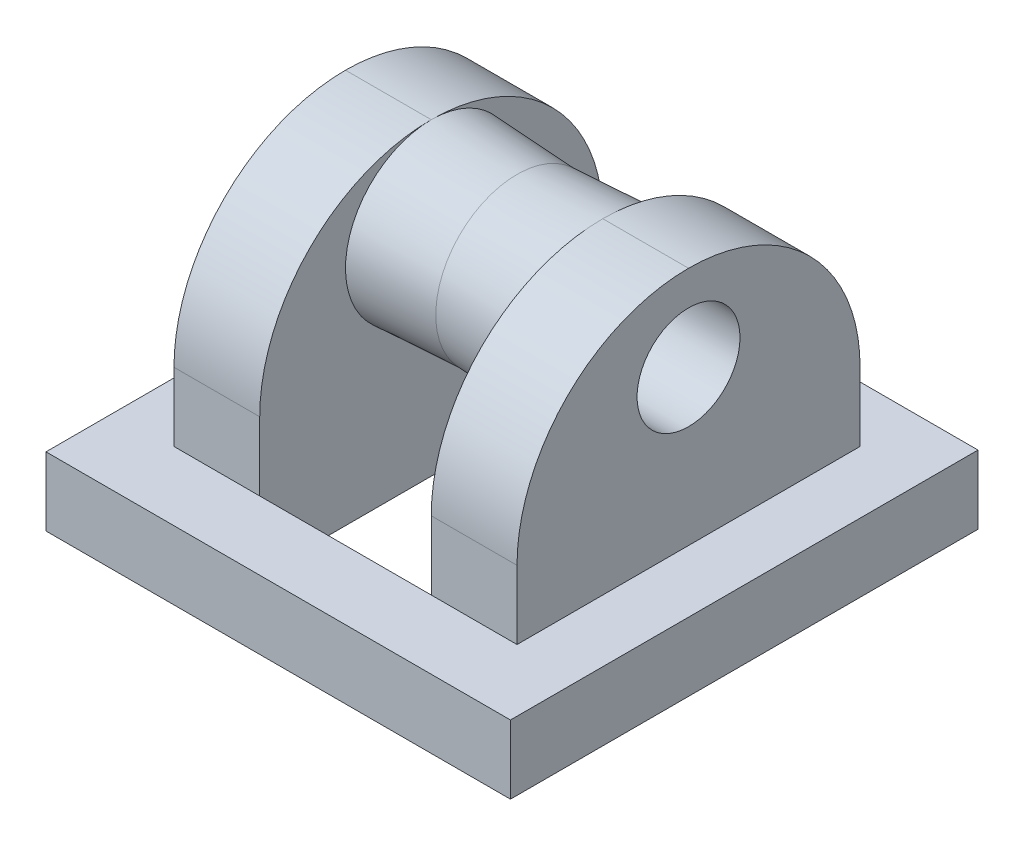
ISO-10303-21;
HEADER;
FILE_DESCRIPTION(('STEP AP214'),'2;1');
FILE_NAME('part.step','',(''),(''),'','','');
FILE_SCHEMA(('AUTOMOTIVE_DESIGN { 1 0 10303 214 1 1 1 1 }'));
ENDSEC;
DATA;
#1=APPLICATION_CONTEXT('core data for automotive mechanical design processes');
#2=APPLICATION_PROTOCOL_DEFINITION('international standard','automotive_design',2000,#1);
#3=PRODUCT_CONTEXT('',#1,'mechanical');
#4=PRODUCT('Part','Part','',(#3));
#5=PRODUCT_RELATED_PRODUCT_CATEGORY('part','',(#4));
#6=PRODUCT_DEFINITION_FORMATION('','',#4);
#7=PRODUCT_DEFINITION_CONTEXT('part definition',#1,'design');
#8=PRODUCT_DEFINITION('design','',#6,#7);
#9=PRODUCT_DEFINITION_SHAPE('','',#8);
#10=(LENGTH_UNIT() NAMED_UNIT(*) SI_UNIT(.MILLI.,.METRE.));
#11=(NAMED_UNIT(*) PLANE_ANGLE_UNIT() SI_UNIT($,.RADIAN.));
#12=(NAMED_UNIT(*) SI_UNIT($,.STERADIAN.) SOLID_ANGLE_UNIT());
#13=UNCERTAINTY_MEASURE_WITH_UNIT(LENGTH_MEASURE(1.E-05),#10,'distance_accuracy_value','');
#14=(GEOMETRIC_REPRESENTATION_CONTEXT(3) GLOBAL_UNCERTAINTY_ASSIGNED_CONTEXT((#13)) GLOBAL_UNIT_ASSIGNED_CONTEXT((#10,
#11,#12)) REPRESENTATION_CONTEXT('',''));
#15=CARTESIAN_POINT('',(0.,0.,0.));
#16=DIRECTION('',(0.,0.,1.));
#17=DIRECTION('',(1.,0.,0.));
#18=AXIS2_PLACEMENT_3D('',#15,#16,#17);
#19=CARTESIAN_POINT('',(0.,115.,20.));
#20=DIRECTION('',(0.,-1.,0.));
#21=DIRECTION('',(0.,0.,-1.));
#22=AXIS2_PLACEMENT_3D('',#19,#20,#21);
#23=PLANE('',#22);
#24=DIRECTION('',(-1.,0.,0.));
#25=VECTOR('',#24,1.);
#26=CARTESIAN_POINT('',(0.,115.,20.));
#27=LINE('',#26,#25);
#28=CARTESIAN_POINT('',(75.8087652062624,115.,20.));
#29=VERTEX_POINT('',#28);
#30=CARTESIAN_POINT('',(62.2696434049317,115.,20.));
#31=VERTEX_POINT('',#30);
#32=EDGE_CURVE('E61',#29,#31,#27,.T.);
#33=ORIENTED_EDGE('',*,*,#32,.F.);
#34=DIRECTION('',(0.,0.,1.));
#35=VECTOR('',#34,1.);
#36=CARTESIAN_POINT('',(75.8087652062624,115.,20.));
#37=LINE('',#36,#35);
#38=CARTESIAN_POINT('',(75.8087652062624,115.,6.37093213171585));
#39=VERTEX_POINT('',#38);
#40=EDGE_CURVE('E170',#39,#29,#37,.T.);
#41=ORIENTED_EDGE('',*,*,#40,.F.);
#42=DIRECTION('',(1.,0.,0.));
#43=VECTOR('',#42,1.);
#44=CARTESIAN_POINT('',(75.8087652062624,115.,6.37093213171585));
#45=LINE('',#44,#43);
#46=CARTESIAN_POINT('',(62.2696434049317,115.,6.37093213171585));
#47=VERTEX_POINT('',#46);
#48=EDGE_CURVE('E155',#47,#39,#45,.T.);
#49=ORIENTED_EDGE('',*,*,#48,.F.);
#50=DIRECTION('',(0.,0.,1.));
#51=VECTOR('',#50,1.);
#52=CARTESIAN_POINT('',(62.2696434049317,115.,20.));
#53=LINE('',#52,#51);
#54=EDGE_CURVE('E175',#47,#31,#53,.T.);
#55=ORIENTED_EDGE('',*,*,#54,.T.);
#56=EDGE_LOOP('',(#33,#41,#49,#55));
#57=FACE_BOUND('',#56,.T.);
#58=DIRECTION('',(-1.,0.,0.));
#59=VECTOR('',#58,1.);
#60=CARTESIAN_POINT('',(0.,115.,18.));
#61=LINE('',#60,#59);
#62=CARTESIAN_POINT('',(73.9999999999999,115.,18.));
#63=VERTEX_POINT('',#62);
#64=CARTESIAN_POINT('',(71.4999999999999,115.,18.));
#65=VERTEX_POINT('',#64);
#66=EDGE_CURVE('E242',#63,#65,#61,.T.);
#67=ORIENTED_EDGE('',*,*,#66,.T.);
#68=DIRECTION('',(1.,0.,0.));
#69=VECTOR('',#68,1.);
#70=CARTESIAN_POINT('',(66.4999999999999,115.,18.));
#71=LINE('',#70,#69);
#72=CARTESIAN_POINT('',(66.4999999999999,115.,18.));
#73=VERTEX_POINT('',#72);
#74=EDGE_CURVE('E282',#73,#65,#71,.T.);
#75=ORIENTED_EDGE('',*,*,#74,.F.);
#76=DIRECTION('',(-1.,0.,0.));
#77=VECTOR('',#76,1.);
#78=CARTESIAN_POINT('',(0.,115.,18.));
#79=LINE('',#78,#77);
#80=CARTESIAN_POINT('',(63.9999999999999,115.,18.));
#81=VERTEX_POINT('',#80);
#82=EDGE_CURVE('E239',#73,#81,#79,.T.);
#83=ORIENTED_EDGE('',*,*,#82,.T.);
#84=DIRECTION('',(0.,0.,1.));
#85=VECTOR('',#84,1.);
#86=CARTESIAN_POINT('',(63.9999999999999,115.,0.));
#87=LINE('',#86,#85);
#88=CARTESIAN_POINT('',(63.9999999999999,115.,7.99999999999999));
#89=VERTEX_POINT('',#88);
#90=EDGE_CURVE('E189',#89,#81,#87,.T.);
#91=ORIENTED_EDGE('',*,*,#90,.F.);
#92=DIRECTION('',(-1.,0.,0.));
#93=VECTOR('',#92,1.);
#94=CARTESIAN_POINT('',(0.,115.,8.00000000000001));
#95=LINE('',#94,#93);
#96=CARTESIAN_POINT('',(66.4999999999999,115.,7.99999999999999));
#97=VERTEX_POINT('',#96);
#98=EDGE_CURVE('E207',#97,#89,#95,.T.);
#99=ORIENTED_EDGE('',*,*,#98,.F.);
#100=DIRECTION('',(-1.,0.,0.));
#101=VECTOR('',#100,1.);
#102=CARTESIAN_POINT('',(66.4999999999999,115.,7.99999999999999));
#103=LINE('',#102,#101);
#104=CARTESIAN_POINT('',(71.4999999999999,115.,7.99999999999999));
#105=VERTEX_POINT('',#104);
#106=EDGE_CURVE('E46',#105,#97,#103,.T.);
#107=ORIENTED_EDGE('',*,*,#106,.F.);
#108=DIRECTION('',(-1.,0.,0.));
#109=VECTOR('',#108,1.);
#110=CARTESIAN_POINT('',(0.,115.,8.00000000000001));
#111=LINE('',#110,#109);
#112=CARTESIAN_POINT('',(73.9999999999999,115.,7.99999999999999));
#113=VERTEX_POINT('',#112);
#114=EDGE_CURVE('E227',#113,#105,#111,.T.);
#115=ORIENTED_EDGE('',*,*,#114,.F.);
#116=DIRECTION('',(0.,0.,1.));
#117=VECTOR('',#116,1.);
#118=CARTESIAN_POINT('',(73.9999999999999,115.,0.));
#119=LINE('',#118,#117);
#120=EDGE_CURVE('E229',#113,#63,#119,.T.);
#121=ORIENTED_EDGE('',*,*,#120,.T.);
#122=EDGE_LOOP('',(#67,#75,#83,#91,#99,#107,#115,#121));
#123=FACE_BOUND('',#122,.T.);
#124=ADVANCED_FACE('F37',(#57,#123),#23,.F.);
#125=CARTESIAN_POINT('',(0.,0.,20.));
#126=DIRECTION('',(0.,0.,1.));
#127=DIRECTION('',(1.,0.,0.));
#128=AXIS2_PLACEMENT_3D('',#125,#126,#127);
#129=PLANE('',#128);
#130=DIRECTION('',(0.,1.,0.));
#131=VECTOR('',#130,1.);
#132=CARTESIAN_POINT('',(75.8087652062624,113.,20.));
#133=LINE('',#132,#131);
#134=CARTESIAN_POINT('',(75.8087652062624,113.,20.));
#135=VERTEX_POINT('',#134);
#136=EDGE_CURVE('E158',#135,#29,#133,.T.);
#137=ORIENTED_EDGE('',*,*,#136,.T.);
#138=ORIENTED_EDGE('',*,*,#32,.T.);
#139=DIRECTION('',(0.,-1.,0.));
#140=VECTOR('',#139,1.);
#141=CARTESIAN_POINT('',(62.2696434049317,135.320705917891,20.));
#142=LINE('',#141,#140);
#143=CARTESIAN_POINT('',(62.2696434049317,113.,20.));
#144=VERTEX_POINT('',#143);
#145=EDGE_CURVE('E41',#31,#144,#142,.T.);
#146=ORIENTED_EDGE('',*,*,#145,.T.);
#147=DIRECTION('',(-1.,0.,0.));
#148=VECTOR('',#147,1.);
#149=CARTESIAN_POINT('',(0.,113.,20.));
#150=LINE('',#149,#148);
#151=EDGE_CURVE('E230',#135,#144,#150,.T.);
#152=ORIENTED_EDGE('',*,*,#151,.F.);
#153=EDGE_LOOP('',(#137,#138,#146,#152));
#154=FACE_BOUND('',#153,.T.);
#155=ADVANCED_FACE('F306',(#154),#129,.T.);
#156=CARTESIAN_POINT('',(0.,113.,20.));
#157=DIRECTION('',(0.,-1.,0.));
#158=DIRECTION('',(0.,0.,-1.));
#159=AXIS2_PLACEMENT_3D('',#156,#157,#158);
#160=PLANE('',#159);
#161=DIRECTION('',(0.,0.,1.));
#162=VECTOR('',#161,1.);
#163=CARTESIAN_POINT('',(75.8087652062624,113.,20.));
#164=LINE('',#163,#162);
#165=CARTESIAN_POINT('',(75.8087652062624,113.,6.37093213171585));
#166=VERTEX_POINT('',#165);
#167=EDGE_CURVE('E162',#166,#135,#164,.T.);
#168=ORIENTED_EDGE('',*,*,#167,.T.);
#169=ORIENTED_EDGE('',*,*,#151,.T.);
#170=DIRECTION('',(0.,0.,1.));
#171=VECTOR('',#170,1.);
#172=CARTESIAN_POINT('',(62.2696434049317,113.,20.));
#173=LINE('',#172,#171);
#174=CARTESIAN_POINT('',(62.2696434049317,113.,6.37093213171585));
#175=VERTEX_POINT('',#174);
#176=EDGE_CURVE('E11',#175,#144,#173,.T.);
#177=ORIENTED_EDGE('',*,*,#176,.F.);
#178=DIRECTION('',(1.,0.,0.));
#179=VECTOR('',#178,1.);
#180=CARTESIAN_POINT('',(75.8087652062624,113.,6.37093213171585));
#181=LINE('',#180,#179);
#182=EDGE_CURVE('E53',#175,#166,#181,.T.);
#183=ORIENTED_EDGE('',*,*,#182,.T.);
#184=EDGE_LOOP('',(#168,#169,#177,#183));
#185=FACE_BOUND('',#184,.T.);
#186=DIRECTION('',(1.,0.,0.));
#187=VECTOR('',#186,1.);
#188=CARTESIAN_POINT('',(66.4999999999999,113.,18.));
#189=LINE('',#188,#187);
#190=CARTESIAN_POINT('',(66.4999999999999,113.,18.));
#191=VERTEX_POINT('',#190);
#192=CARTESIAN_POINT('',(71.4999999999999,113.,18.));
#193=VERTEX_POINT('',#192);
#194=EDGE_CURVE('E232',#191,#193,#189,.T.);
#195=ORIENTED_EDGE('',*,*,#194,.T.);
#196=DIRECTION('',(0.,0.,-1.));
#197=VECTOR('',#196,1.);
#198=CARTESIAN_POINT('',(71.4999999999999,113.,18.));
#199=LINE('',#198,#197);
#200=CARTESIAN_POINT('',(71.4999999999999,113.,7.99999999999999));
#201=VERTEX_POINT('',#200);
#202=EDGE_CURVE('E288',#193,#201,#199,.T.);
#203=ORIENTED_EDGE('',*,*,#202,.T.);
#204=DIRECTION('',(-1.,0.,0.));
#205=VECTOR('',#204,1.);
#206=CARTESIAN_POINT('',(66.4999999999999,113.,7.99999999999999));
#207=LINE('',#206,#205);
#208=CARTESIAN_POINT('',(66.4999999999999,113.,7.99999999999999));
#209=VERTEX_POINT('',#208);
#210=EDGE_CURVE('E291',#201,#209,#207,.T.);
#211=ORIENTED_EDGE('',*,*,#210,.T.);
#212=DIRECTION('',(0.,0.,1.));
#213=VECTOR('',#212,1.);
#214=CARTESIAN_POINT('',(66.4999999999999,113.,18.));
#215=LINE('',#214,#213);
#216=EDGE_CURVE('E194',#209,#191,#215,.T.);
#217=ORIENTED_EDGE('',*,*,#216,.T.);
#218=EDGE_LOOP('',(#195,#203,#211,#217));
#219=FACE_BOUND('',#218,.T.);
#220=ADVANCED_FACE('F168',(#185,#219),#160,.T.);
#221=CARTESIAN_POINT('',(66.4999999999999,122.,0.));
#222=DIRECTION('',(1.,0.,0.));
#223=DIRECTION('',(0.,0.,-1.));
#224=AXIS2_PLACEMENT_3D('',#221,#222,#223);
#225=PLANE('',#224);
#226=CARTESIAN_POINT('',(66.4999999999999,117.,13.));
#227=DIRECTION('',(1.,0.,0.));
#228=DIRECTION('',(0.,0.,-1.));
#229=AXIS2_PLACEMENT_3D('',#226,#227,#228);
#230=CIRCLE('',#229,5.);
#231=CARTESIAN_POINT('',(66.4999999999999,117.,7.99999999999999));
#232=VERTEX_POINT('',#231);
#233=CARTESIAN_POINT('',(66.4999999999999,122.,13.));
#234=VERTEX_POINT('',#233);
#235=EDGE_CURVE('E190',#232,#234,#230,.T.);
#236=ORIENTED_EDGE('',*,*,#235,.T.);
#237=CARTESIAN_POINT('',(66.4999999999999,119.5,13.));
#238=DIRECTION('',(1.,0.,0.));
#239=DIRECTION('',(0.,0.,-1.));
#240=AXIS2_PLACEMENT_3D('',#237,#238,#239);
#241=CIRCLE('',#240,2.5);
#242=EDGE_CURVE('E275',#234,#234,#241,.T.);
#243=ORIENTED_EDGE('',*,*,#242,.F.);
#244=CARTESIAN_POINT('',(66.4999999999999,117.,13.));
#245=DIRECTION('',(1.,0.,0.));
#246=DIRECTION('',(0.,0.,-1.));
#247=AXIS2_PLACEMENT_3D('',#244,#245,#246);
#248=CIRCLE('',#247,5.);
#249=CARTESIAN_POINT('',(66.4999999999999,117.,18.));
#250=VERTEX_POINT('',#249);
#251=EDGE_CURVE('E193',#234,#250,#248,.T.);
#252=ORIENTED_EDGE('',*,*,#251,.T.);
#253=DIRECTION('',(0.,-1.,0.));
#254=VECTOR('',#253,1.);
#255=CARTESIAN_POINT('',(66.4999999999999,122.,18.));
#256=LINE('',#255,#254);
#257=EDGE_CURVE('E196',#250,#73,#256,.T.);
#258=ORIENTED_EDGE('',*,*,#257,.T.);
#259=DIRECTION('',(0.,1.,0.));
#260=VECTOR('',#259,1.);
#261=CARTESIAN_POINT('',(66.4999999999999,101.819660112501,18.));
#262=LINE('',#261,#260);
#263=EDGE_CURVE('E272',#191,#73,#262,.T.);
#264=ORIENTED_EDGE('',*,*,#263,.F.);
#265=ORIENTED_EDGE('',*,*,#216,.F.);
#266=DIRECTION('',(0.,1.,0.));
#267=VECTOR('',#266,1.);
#268=CARTESIAN_POINT('',(66.4999999999999,101.819660112501,7.99999999999999));
#269=LINE('',#268,#267);
#270=EDGE_CURVE('E201',#209,#97,#269,.T.);
#271=ORIENTED_EDGE('',*,*,#270,.T.);
#272=DIRECTION('',(0.,-1.,0.));
#273=VECTOR('',#272,1.);
#274=CARTESIAN_POINT('',(66.4999999999999,122.,7.99999999999999));
#275=LINE('',#274,#273);
#276=EDGE_CURVE('E200',#232,#97,#275,.T.);
#277=ORIENTED_EDGE('',*,*,#276,.F.);
#278=EDGE_LOOP('',(#236,#243,#252,#258,#264,#265,#271,#277));
#279=FACE_BOUND('',#278,.T.);
#280=ADVANCED_FACE('F312',(#279),#225,.T.);
#281=CARTESIAN_POINT('',(0.,122.,8.00000000000001));
#282=DIRECTION('',(0.,0.,1.));
#283=DIRECTION('',(1.,0.,0.));
#284=AXIS2_PLACEMENT_3D('',#281,#282,#283);
#285=PLANE('',#284);
#286=DIRECTION('',(0.,-1.,0.));
#287=VECTOR('',#286,1.);
#288=CARTESIAN_POINT('',(63.9999999999999,122.,7.99999999999999));
#289=LINE('',#288,#287);
#290=CARTESIAN_POINT('',(63.9999999999999,117.,7.99999999999999));
#291=VERTEX_POINT('',#290);
#292=EDGE_CURVE('E204',#291,#89,#289,.T.);
#293=ORIENTED_EDGE('',*,*,#292,.F.);
#294=DIRECTION('',(-1.,0.,0.));
#295=VECTOR('',#294,1.);
#296=CARTESIAN_POINT('',(66.4999999999999,117.,7.99999999999999));
#297=LINE('',#296,#295);
#298=EDGE_CURVE('E197',#291,#232,#297,.F.);
#299=ORIENTED_EDGE('',*,*,#298,.T.);
#300=ORIENTED_EDGE('',*,*,#276,.T.);
#301=ORIENTED_EDGE('',*,*,#98,.T.);
#302=EDGE_LOOP('',(#293,#299,#300,#301));
#303=FACE_BOUND('',#302,.T.);
#304=ADVANCED_FACE('F369',(#303),#285,.F.);
#305=CARTESIAN_POINT('',(63.9999999999999,122.,0.));
#306=DIRECTION('',(1.,0.,0.));
#307=DIRECTION('',(0.,0.,-1.));
#308=AXIS2_PLACEMENT_3D('',#305,#306,#307);
#309=PLANE('',#308);
#310=CARTESIAN_POINT('',(63.9999999999999,119.5,13.));
#311=DIRECTION('',(1.,0.,0.));
#312=DIRECTION('',(0.,0.,-1.));
#313=AXIS2_PLACEMENT_3D('',#310,#311,#312);
#314=CIRCLE('',#313,1.5);
#315=CARTESIAN_POINT('',(63.9999999999999,119.5,11.5));
#316=VERTEX_POINT('',#315);
#317=EDGE_CURVE('E264',#316,#316,#314,.F.);
#318=ORIENTED_EDGE('',*,*,#317,.F.);
#319=EDGE_LOOP('',(#318));
#320=FACE_BOUND('',#319,.T.);
#321=CARTESIAN_POINT('',(63.9999999999999,117.,13.));
#322=DIRECTION('',(1.,0.,0.));
#323=DIRECTION('',(0.,0.,-1.));
#324=AXIS2_PLACEMENT_3D('',#321,#322,#323);
#325=CIRCLE('',#324,5.);
#326=CARTESIAN_POINT('',(63.9999999999999,117.,18.));
#327=VERTEX_POINT('',#326);
#328=CARTESIAN_POINT('',(63.9999999999999,122.,13.));
#329=VERTEX_POINT('',#328);
#330=EDGE_CURVE('E205',#327,#329,#325,.F.);
#331=ORIENTED_EDGE('',*,*,#330,.T.);
#332=CARTESIAN_POINT('',(63.9999999999999,117.,13.));
#333=DIRECTION('',(1.,0.,0.));
#334=DIRECTION('',(0.,0.,-1.));
#335=AXIS2_PLACEMENT_3D('',#332,#333,#334);
#336=CIRCLE('',#335,5.);
#337=EDGE_CURVE('E202',#329,#291,#336,.F.);
#338=ORIENTED_EDGE('',*,*,#337,.T.);
#339=ORIENTED_EDGE('',*,*,#292,.T.);
#340=ORIENTED_EDGE('',*,*,#90,.T.);
#341=DIRECTION('',(0.,-1.,0.));
#342=VECTOR('',#341,1.);
#343=CARTESIAN_POINT('',(63.9999999999999,122.,18.));
#344=LINE('',#343,#342);
#345=EDGE_CURVE('E188',#327,#81,#344,.T.);
#346=ORIENTED_EDGE('',*,*,#345,.F.);
#347=EDGE_LOOP('',(#331,#338,#339,#340,#346));
#348=FACE_BOUND('',#347,.T.);
#349=ADVANCED_FACE('F365',(#320,#348),#309,.F.);
#350=CARTESIAN_POINT('',(0.,122.,18.));
#351=DIRECTION('',(0.,0.,1.));
#352=DIRECTION('',(1.,0.,0.));
#353=AXIS2_PLACEMENT_3D('',#350,#351,#352);
#354=PLANE('',#353);
#355=ORIENTED_EDGE('',*,*,#257,.F.);
#356=DIRECTION('',(-1.,0.,0.));
#357=VECTOR('',#356,1.);
#358=CARTESIAN_POINT('',(0.,117.,18.));
#359=LINE('',#358,#357);
#360=EDGE_CURVE('E186',#250,#327,#359,.T.);
#361=ORIENTED_EDGE('',*,*,#360,.T.);
#362=ORIENTED_EDGE('',*,*,#345,.T.);
#363=ORIENTED_EDGE('',*,*,#82,.F.);
#364=EDGE_LOOP('',(#355,#361,#362,#363));
#365=FACE_BOUND('',#364,.T.);
#366=ADVANCED_FACE('F361',(#365),#354,.T.);
#367=CARTESIAN_POINT('',(0.,122.,8.00000000000001));
#368=DIRECTION('',(0.,0.,1.));
#369=DIRECTION('',(1.,0.,0.));
#370=AXIS2_PLACEMENT_3D('',#367,#368,#369);
#371=PLANE('',#370);
#372=DIRECTION('',(0.,-1.,0.));
#373=VECTOR('',#372,1.);
#374=CARTESIAN_POINT('',(71.4999999999999,122.,7.99999999999999));
#375=LINE('',#374,#373);
#376=CARTESIAN_POINT('',(71.4999999999999,117.,7.99999999999999));
#377=VERTEX_POINT('',#376);
#378=EDGE_CURVE('E222',#377,#105,#375,.T.);
#379=ORIENTED_EDGE('',*,*,#378,.F.);
#380=DIRECTION('',(-1.,0.,0.));
#381=VECTOR('',#380,1.);
#382=CARTESIAN_POINT('',(73.9999999999999,117.,7.99999999999999));
#383=LINE('',#382,#381);
#384=CARTESIAN_POINT('',(73.9999999999999,117.,7.99999999999999));
#385=VERTEX_POINT('',#384);
#386=EDGE_CURVE('E216',#377,#385,#383,.F.);
#387=ORIENTED_EDGE('',*,*,#386,.T.);
#388=DIRECTION('',(0.,-1.,0.));
#389=VECTOR('',#388,1.);
#390=CARTESIAN_POINT('',(73.9999999999999,122.,7.99999999999999));
#391=LINE('',#390,#389);
#392=EDGE_CURVE('E219',#385,#113,#391,.T.);
#393=ORIENTED_EDGE('',*,*,#392,.T.);
#394=ORIENTED_EDGE('',*,*,#114,.T.);
#395=EDGE_LOOP('',(#379,#387,#393,#394));
#396=FACE_BOUND('',#395,.T.);
#397=ADVANCED_FACE('F357',(#396),#371,.F.);
#398=CARTESIAN_POINT('',(71.4999999999999,122.,0.));
#399=DIRECTION('',(1.,0.,0.));
#400=DIRECTION('',(0.,0.,-1.));
#401=AXIS2_PLACEMENT_3D('',#398,#399,#400);
#402=PLANE('',#401);
#403=CARTESIAN_POINT('',(71.4999999999999,117.,13.));
#404=DIRECTION('',(1.,0.,0.));
#405=DIRECTION('',(0.,0.,-1.));
#406=AXIS2_PLACEMENT_3D('',#403,#404,#405);
#407=CIRCLE('',#406,5.);
#408=CARTESIAN_POINT('',(71.4999999999999,117.,18.));
#409=VERTEX_POINT('',#408);
#410=CARTESIAN_POINT('',(71.4999999999999,122.,13.));
#411=VERTEX_POINT('',#410);
#412=EDGE_CURVE('E224',#409,#411,#407,.F.);
#413=ORIENTED_EDGE('',*,*,#412,.T.);
#414=CARTESIAN_POINT('',(71.4999999999999,119.5,13.));
#415=DIRECTION('',(1.,0.,0.));
#416=DIRECTION('',(0.,0.,-1.));
#417=AXIS2_PLACEMENT_3D('',#414,#415,#416);
#418=CIRCLE('',#417,2.5);
#419=EDGE_CURVE('E223',#411,#411,#418,.T.);
#420=ORIENTED_EDGE('',*,*,#419,.T.);
#421=CARTESIAN_POINT('',(71.4999999999999,117.,13.));
#422=DIRECTION('',(1.,0.,0.));
#423=DIRECTION('',(0.,0.,-1.));
#424=AXIS2_PLACEMENT_3D('',#421,#422,#423);
#425=CIRCLE('',#424,5.);
#426=EDGE_CURVE('E220',#411,#377,#425,.F.);
#427=ORIENTED_EDGE('',*,*,#426,.T.);
#428=ORIENTED_EDGE('',*,*,#378,.T.);
#429=DIRECTION('',(0.,1.,0.));
#430=VECTOR('',#429,1.);
#431=CARTESIAN_POINT('',(71.4999999999999,101.819660112501,7.99999999999999));
#432=LINE('',#431,#430);
#433=EDGE_CURVE('E285',#201,#105,#432,.T.);
#434=ORIENTED_EDGE('',*,*,#433,.F.);
#435=ORIENTED_EDGE('',*,*,#202,.F.);
#436=DIRECTION('',(0.,1.,0.));
#437=VECTOR('',#436,1.);
#438=CARTESIAN_POINT('',(71.4999999999999,101.819660112501,18.));
#439=LINE('',#438,#437);
#440=EDGE_CURVE('E211',#193,#65,#439,.T.);
#441=ORIENTED_EDGE('',*,*,#440,.T.);
#442=DIRECTION('',(0.,-1.,0.));
#443=VECTOR('',#442,1.);
#444=CARTESIAN_POINT('',(71.4999999999999,122.,18.));
#445=LINE('',#444,#443);
#446=EDGE_CURVE('E210',#409,#65,#445,.T.);
#447=ORIENTED_EDGE('',*,*,#446,.F.);
#448=EDGE_LOOP('',(#413,#420,#427,#428,#434,#435,#441,#447));
#449=FACE_BOUND('',#448,.T.);
#450=ADVANCED_FACE('F353',(#449),#402,.F.);
#451=CARTESIAN_POINT('',(0.,122.,18.));
#452=DIRECTION('',(0.,0.,1.));
#453=DIRECTION('',(1.,0.,0.));
#454=AXIS2_PLACEMENT_3D('',#451,#452,#453);
#455=PLANE('',#454);
#456=DIRECTION('',(0.,-1.,0.));
#457=VECTOR('',#456,1.);
#458=CARTESIAN_POINT('',(73.9999999999999,122.,18.));
#459=LINE('',#458,#457);
#460=CARTESIAN_POINT('',(73.9999999999999,117.,18.));
#461=VERTEX_POINT('',#460);
#462=EDGE_CURVE('E185',#461,#63,#459,.T.);
#463=ORIENTED_EDGE('',*,*,#462,.F.);
#464=DIRECTION('',(-1.,0.,0.));
#465=VECTOR('',#464,1.);
#466=CARTESIAN_POINT('',(0.,117.,18.));
#467=LINE('',#466,#465);
#468=EDGE_CURVE('E208',#461,#409,#467,.T.);
#469=ORIENTED_EDGE('',*,*,#468,.T.);
#470=ORIENTED_EDGE('',*,*,#446,.T.);
#471=ORIENTED_EDGE('',*,*,#66,.F.);
#472=EDGE_LOOP('',(#463,#469,#470,#471));
#473=FACE_BOUND('',#472,.T.);
#474=ADVANCED_FACE('F349',(#473),#455,.T.);
#475=CARTESIAN_POINT('',(73.9999999999999,122.,0.));
#476=DIRECTION('',(1.,0.,0.));
#477=DIRECTION('',(0.,0.,-1.));
#478=AXIS2_PLACEMENT_3D('',#475,#476,#477);
#479=PLANE('',#478);
#480=CARTESIAN_POINT('',(73.9999999999999,119.5,13.));
#481=DIRECTION('',(1.,0.,0.));
#482=DIRECTION('',(0.,0.,-1.));
#483=AXIS2_PLACEMENT_3D('',#480,#481,#482);
#484=CIRCLE('',#483,1.5);
#485=CARTESIAN_POINT('',(73.9999999999999,119.5,11.5));
#486=VERTEX_POINT('',#485);
#487=EDGE_CURVE('E181',#486,#486,#484,.T.);
#488=ORIENTED_EDGE('',*,*,#487,.F.);
#489=EDGE_LOOP('',(#488));
#490=FACE_BOUND('',#489,.T.);
#491=ORIENTED_EDGE('',*,*,#392,.F.);
#492=CARTESIAN_POINT('',(73.9999999999999,117.,13.));
#493=DIRECTION('',(1.,0.,0.));
#494=DIRECTION('',(0.,0.,-1.));
#495=AXIS2_PLACEMENT_3D('',#492,#493,#494);
#496=CIRCLE('',#495,5.);
#497=CARTESIAN_POINT('',(73.9999999999999,122.,13.));
#498=VERTEX_POINT('',#497);
#499=EDGE_CURVE('E212',#385,#498,#496,.T.);
#500=ORIENTED_EDGE('',*,*,#499,.T.);
#501=CARTESIAN_POINT('',(73.9999999999999,117.,13.));
#502=DIRECTION('',(1.,0.,0.));
#503=DIRECTION('',(0.,0.,-1.));
#504=AXIS2_PLACEMENT_3D('',#501,#502,#503);
#505=CIRCLE('',#504,5.);
#506=EDGE_CURVE('E214',#498,#461,#505,.T.);
#507=ORIENTED_EDGE('',*,*,#506,.T.);
#508=ORIENTED_EDGE('',*,*,#462,.T.);
#509=ORIENTED_EDGE('',*,*,#120,.F.);
#510=EDGE_LOOP('',(#491,#500,#507,#508,#509));
#511=FACE_BOUND('',#510,.T.);
#512=ADVANCED_FACE('F345',(#490,#511),#479,.T.);
#513=CARTESIAN_POINT('',(0.,117.,13.));
#514=DIRECTION('',(-1.,0.,0.));
#515=DIRECTION('',(0.,0.,1.));
#516=AXIS2_PLACEMENT_3D('',#513,#514,#515);
#517=CYLINDRICAL_SURFACE('',#516,5.);
#518=ORIENTED_EDGE('',*,*,#468,.F.);
#519=ORIENTED_EDGE('',*,*,#506,.F.);
#520=DIRECTION('',(-1.,0.,0.));
#521=VECTOR('',#520,1.);
#522=CARTESIAN_POINT('',(0.,122.,13.));
#523=LINE('',#522,#521);
#524=EDGE_CURVE('E182',#411,#498,#523,.F.);
#525=ORIENTED_EDGE('',*,*,#524,.F.);
#526=ORIENTED_EDGE('',*,*,#412,.F.);
#527=EDGE_LOOP('',(#518,#519,#525,#526));
#528=FACE_BOUND('',#527,.T.);
#529=ADVANCED_FACE('F348',(#528),#517,.T.);
#530=CARTESIAN_POINT('',(0.,117.,13.));
#531=DIRECTION('',(1.,0.,0.));
#532=DIRECTION('',(0.,0.,-1.));
#533=AXIS2_PLACEMENT_3D('',#530,#531,#532);
#534=CYLINDRICAL_SURFACE('',#533,5.);
#535=ORIENTED_EDGE('',*,*,#499,.F.);
#536=ORIENTED_EDGE('',*,*,#386,.F.);
#537=ORIENTED_EDGE('',*,*,#426,.F.);
#538=ORIENTED_EDGE('',*,*,#524,.T.);
#539=EDGE_LOOP('',(#535,#536,#537,#538));
#540=FACE_BOUND('',#539,.T.);
#541=ADVANCED_FACE('F377',(#540),#534,.T.);
#542=CARTESIAN_POINT('',(0.,117.,13.));
#543=DIRECTION('',(-1.,0.,0.));
#544=DIRECTION('',(0.,0.,1.));
#545=AXIS2_PLACEMENT_3D('',#542,#543,#544);
#546=CYLINDRICAL_SURFACE('',#545,5.);
#547=ORIENTED_EDGE('',*,*,#360,.F.);
#548=ORIENTED_EDGE('',*,*,#251,.F.);
#549=DIRECTION('',(-1.,0.,0.));
#550=VECTOR('',#549,1.);
#551=CARTESIAN_POINT('',(0.,122.,13.));
#552=LINE('',#551,#550);
#553=EDGE_CURVE('E178',#329,#234,#552,.F.);
#554=ORIENTED_EDGE('',*,*,#553,.F.);
#555=ORIENTED_EDGE('',*,*,#330,.F.);
#556=EDGE_LOOP('',(#547,#548,#554,#555));
#557=FACE_BOUND('',#556,.T.);
#558=ADVANCED_FACE('F380',(#557),#546,.T.);
#559=CARTESIAN_POINT('',(0.,117.,13.));
#560=DIRECTION('',(1.,0.,0.));
#561=DIRECTION('',(0.,0.,-1.));
#562=AXIS2_PLACEMENT_3D('',#559,#560,#561);
#563=CYLINDRICAL_SURFACE('',#562,5.);
#564=ORIENTED_EDGE('',*,*,#235,.F.);
#565=ORIENTED_EDGE('',*,*,#298,.F.);
#566=ORIENTED_EDGE('',*,*,#337,.F.);
#567=ORIENTED_EDGE('',*,*,#553,.T.);
#568=EDGE_LOOP('',(#564,#565,#566,#567));
#569=FACE_BOUND('',#568,.T.);
#570=ADVANCED_FACE('F385',(#569),#563,.T.);
#571=CARTESIAN_POINT('',(59.7573593128806,119.5,13.));
#572=DIRECTION('',(1.,0.,0.));
#573=DIRECTION('',(0.,0.,-1.));
#574=AXIS2_PLACEMENT_3D('',#571,#572,#573);
#575=CYLINDRICAL_SURFACE('',#574,1.5);
#576=ORIENTED_EDGE('',*,*,#487,.T.);
#577=EDGE_LOOP('',(#576));
#578=FACE_BOUND('',#577,.T.);
#579=CARTESIAN_POINT('',(71.4999999999999,119.5,13.));
#580=DIRECTION('',(1.,0.,0.));
#581=DIRECTION('',(0.,0.,-1.));
#582=AXIS2_PLACEMENT_3D('',#579,#580,#581);
#583=CIRCLE('',#582,1.5);
#584=CARTESIAN_POINT('',(71.4999999999999,119.5,11.5));
#585=VERTEX_POINT('',#584);
#586=EDGE_CURVE('E259',#585,#585,#583,.T.);
#587=ORIENTED_EDGE('',*,*,#586,.F.);
#588=EDGE_LOOP('',(#587));
#589=FACE_BOUND('',#588,.T.);
#590=ADVANCED_FACE('F343',(#578,#589),#575,.F.);
#591=CARTESIAN_POINT('',(66.4999999999999,119.5,13.));
#592=DIRECTION('',(1.,0.,0.));
#593=DIRECTION('',(0.,0.,-1.));
#594=AXIS2_PLACEMENT_3D('',#591,#592,#593);
#595=CIRCLE('',#594,1.5);
#596=CARTESIAN_POINT('',(66.4999999999999,119.5,11.5));
#597=VERTEX_POINT('',#596);
#598=EDGE_CURVE('E267',#597,#597,#595,.F.);
#599=ORIENTED_EDGE('',*,*,#598,.F.);
#600=EDGE_LOOP('',(#599));
#601=FACE_BOUND('',#600,.T.);
#602=ORIENTED_EDGE('',*,*,#317,.T.);
#603=EDGE_LOOP('',(#602));
#604=FACE_BOUND('',#603,.T.);
#605=ADVANCED_FACE('F336',(#601,#604),#575,.F.);
#606=CARTESIAN_POINT('',(66.4999999999999,119.5,13.));
#607=DIRECTION('',(1.,0.,0.));
#608=DIRECTION('',(0.,0.,-1.));
#609=AXIS2_PLACEMENT_3D('',#606,#607,#608);
#610=CONICAL_SURFACE('',#609,1.5,0.05235987755983);
#611=CARTESIAN_POINT('',(68.9999999999999,119.5,13.));
#612=DIRECTION('',(1.,0.,0.));
#613=DIRECTION('',(0.,0.,-1.));
#614=AXIS2_PLACEMENT_3D('',#611,#612,#613);
#615=CIRCLE('',#614,1.63101944820761);
#616=CARTESIAN_POINT('',(68.9999999999999,119.5,11.3689805517924));
#617=VERTEX_POINT('',#616);
#618=EDGE_CURVE('E263',#617,#617,#615,.F.);
#619=ORIENTED_EDGE('',*,*,#618,.F.);
#620=EDGE_LOOP('',(#619));
#621=FACE_BOUND('',#620,.T.);
#622=ORIENTED_EDGE('',*,*,#598,.T.);
#623=EDGE_LOOP('',(#622));
#624=FACE_BOUND('',#623,.T.);
#625=ADVANCED_FACE('F333',(#621,#624),#610,.F.);
#626=CARTESIAN_POINT('',(66.4999999999999,119.5,13.));
#627=DIRECTION('',(-1.,0.,0.));
#628=DIRECTION('',(0.,0.,-1.));
#629=AXIS2_PLACEMENT_3D('',#626,#627,#628);
#630=CONICAL_SURFACE('',#629,2.5,0.05235987755983);
#631=CARTESIAN_POINT('',(68.9999999999999,119.5,13.));
#632=DIRECTION('',(1.,0.,0.));
#633=DIRECTION('',(0.,0.,-1.));
#634=AXIS2_PLACEMENT_3D('',#631,#632,#633);
#635=CIRCLE('',#634,2.3689805517924);
#636=CARTESIAN_POINT('',(68.9999999999999,119.5,10.6310194482076));
#637=VERTEX_POINT('',#636);
#638=EDGE_CURVE('E262',#637,#637,#635,.T.);
#639=ORIENTED_EDGE('',*,*,#638,.F.);
#640=EDGE_LOOP('',(#639));
#641=FACE_BOUND('',#640,.T.);
#642=ORIENTED_EDGE('',*,*,#242,.T.);
#643=EDGE_LOOP('',(#642));
#644=FACE_BOUND('',#643,.T.);
#645=ADVANCED_FACE('F328',(#641,#644),#630,.T.);
#646=CARTESIAN_POINT('',(71.4999999999999,119.5,13.));
#647=DIRECTION('',(-1.,0.,0.));
#648=DIRECTION('',(0.,0.,-1.));
#649=AXIS2_PLACEMENT_3D('',#646,#647,#648);
#650=CONICAL_SURFACE('',#649,1.5,0.05235987755983);
#651=ORIENTED_EDGE('',*,*,#618,.T.);
#652=EDGE_LOOP('',(#651));
#653=FACE_BOUND('',#652,.T.);
#654=ORIENTED_EDGE('',*,*,#586,.T.);
#655=EDGE_LOOP('',(#654));
#656=FACE_BOUND('',#655,.T.);
#657=ADVANCED_FACE('F325',(#653,#656),#650,.F.);
#658=CARTESIAN_POINT('',(71.4999999999999,119.5,13.));
#659=DIRECTION('',(1.,0.,0.));
#660=DIRECTION('',(0.,0.,-1.));
#661=AXIS2_PLACEMENT_3D('',#658,#659,#660);
#662=CONICAL_SURFACE('',#661,2.5,0.05235987755983);
#663=ORIENTED_EDGE('',*,*,#638,.T.);
#664=EDGE_LOOP('',(#663));
#665=FACE_BOUND('',#664,.T.);
#666=ORIENTED_EDGE('',*,*,#419,.F.);
#667=EDGE_LOOP('',(#666));
#668=FACE_BOUND('',#667,.T.);
#669=ADVANCED_FACE('F323',(#665,#668),#662,.T.);
#670=CARTESIAN_POINT('',(66.4999999999999,101.819660112501,18.));
#671=DIRECTION('',(0.,0.,1.));
#672=DIRECTION('',(1.,0.,0.));
#673=AXIS2_PLACEMENT_3D('',#670,#671,#672);
#674=PLANE('',#673);
#675=ORIENTED_EDGE('',*,*,#263,.T.);
#676=ORIENTED_EDGE('',*,*,#74,.T.);
#677=ORIENTED_EDGE('',*,*,#440,.F.);
#678=ORIENTED_EDGE('',*,*,#194,.F.);
#679=EDGE_LOOP('',(#675,#676,#677,#678));
#680=FACE_BOUND('',#679,.T.);
#681=ADVANCED_FACE('F319',(#680),#674,.F.);
#682=CARTESIAN_POINT('',(66.4999999999999,101.819660112501,7.99999999999999));
#683=DIRECTION('',(0.,0.,-1.));
#684=DIRECTION('',(-1.,0.,0.));
#685=AXIS2_PLACEMENT_3D('',#682,#683,#684);
#686=PLANE('',#685);
#687=ORIENTED_EDGE('',*,*,#433,.T.);
#688=ORIENTED_EDGE('',*,*,#106,.T.);
#689=ORIENTED_EDGE('',*,*,#270,.F.);
#690=ORIENTED_EDGE('',*,*,#210,.F.);
#691=EDGE_LOOP('',(#687,#688,#689,#690));
#692=FACE_BOUND('',#691,.T.);
#693=ADVANCED_FACE('F316',(#692),#686,.F.);
#694=CARTESIAN_POINT('',(62.2696434049317,135.320705917891,20.));
#695=DIRECTION('',(1.,0.,0.));
#696=DIRECTION('',(0.,0.,-1.));
#697=AXIS2_PLACEMENT_3D('',#694,#695,#696);
#698=PLANE('',#697);
#699=ORIENTED_EDGE('',*,*,#54,.F.);
#700=DIRECTION('',(0.,1.,0.));
#701=VECTOR('',#700,1.);
#702=CARTESIAN_POINT('',(62.2696434049317,113.,6.37093213171585));
#703=LINE('',#702,#701);
#704=EDGE_CURVE('E159',#175,#47,#703,.T.);
#705=ORIENTED_EDGE('',*,*,#704,.F.);
#706=ORIENTED_EDGE('',*,*,#176,.T.);
#707=ORIENTED_EDGE('',*,*,#145,.F.);
#708=EDGE_LOOP('',(#699,#705,#706,#707));
#709=FACE_BOUND('',#708,.T.);
#710=ADVANCED_FACE('F39',(#709),#698,.F.);
#711=CARTESIAN_POINT('',(75.8087652062624,113.,20.));
#712=DIRECTION('',(-1.,0.,0.));
#713=DIRECTION('',(0.,0.,1.));
#714=AXIS2_PLACEMENT_3D('',#711,#712,#713);
#715=PLANE('',#714);
#716=ORIENTED_EDGE('',*,*,#40,.T.);
#717=ORIENTED_EDGE('',*,*,#136,.F.);
#718=ORIENTED_EDGE('',*,*,#167,.F.);
#719=DIRECTION('',(0.,1.,0.));
#720=VECTOR('',#719,1.);
#721=CARTESIAN_POINT('',(75.8087652062624,113.,6.37093213171585));
#722=LINE('',#721,#720);
#723=EDGE_CURVE('E151',#166,#39,#722,.T.);
#724=ORIENTED_EDGE('',*,*,#723,.T.);
#725=EDGE_LOOP('',(#716,#717,#718,#724));
#726=FACE_BOUND('',#725,.T.);
#727=ADVANCED_FACE('F163',(#726),#715,.F.);
#728=CARTESIAN_POINT('',(75.8087652062624,113.,6.37093213171585));
#729=DIRECTION('',(0.,0.,1.));
#730=DIRECTION('',(1.,0.,0.));
#731=AXIS2_PLACEMENT_3D('',#728,#729,#730);
#732=PLANE('',#731);
#733=ORIENTED_EDGE('',*,*,#48,.T.);
#734=ORIENTED_EDGE('',*,*,#723,.F.);
#735=ORIENTED_EDGE('',*,*,#182,.F.);
#736=ORIENTED_EDGE('',*,*,#704,.T.);
#737=EDGE_LOOP('',(#733,#734,#735,#736));
#738=FACE_BOUND('',#737,.T.);
#739=ADVANCED_FACE('F153',(#738),#732,.F.);
#740=CLOSED_SHELL('',(#124,#155,#220,#280,#304,#349,#366,#397,#450,#474,#512,#529,#541,#558,
#570,#590,#605,#625,#645,#657,#669,#681,#693,#710,#727,#739));
#741=MANIFOLD_SOLID_BREP('B2',#740);
#742=ADVANCED_BREP_SHAPE_REPRESENTATION('',(#18,#741),#14);
#743=SHAPE_DEFINITION_REPRESENTATION(#9,#742);
ENDSEC;
END-ISO-10303-21;
